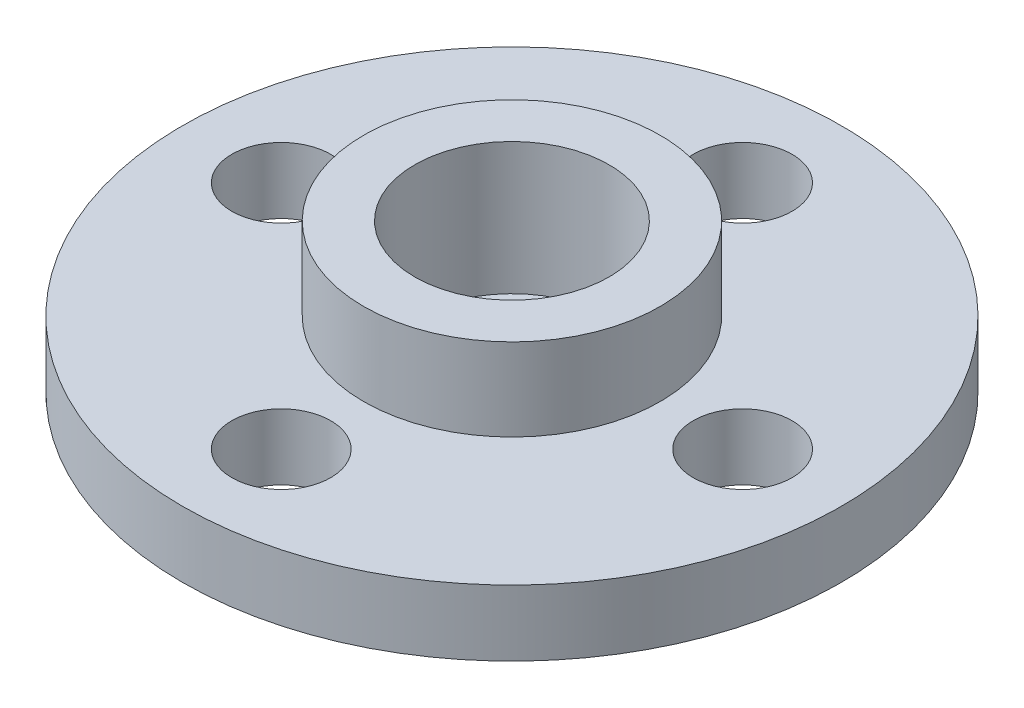
ISO-10303-21;
HEADER;
FILE_DESCRIPTION(('STEP AP214'),'2;1');
FILE_NAME('part.step','',(''),(''),'','','');
FILE_SCHEMA(('AUTOMOTIVE_DESIGN { 1 0 10303 214 1 1 1 1 }'));
ENDSEC;
DATA;
#1=APPLICATION_CONTEXT('core data for automotive mechanical design processes');
#2=APPLICATION_PROTOCOL_DEFINITION('international standard','automotive_design',2000,#1);
#3=PRODUCT_CONTEXT('',#1,'mechanical');
#4=PRODUCT('Part','Part','',(#3));
#5=PRODUCT_RELATED_PRODUCT_CATEGORY('part','',(#4));
#6=PRODUCT_DEFINITION_FORMATION('','',#4);
#7=PRODUCT_DEFINITION_CONTEXT('part definition',#1,'design');
#8=PRODUCT_DEFINITION('design','',#6,#7);
#9=PRODUCT_DEFINITION_SHAPE('','',#8);
#10=(LENGTH_UNIT() NAMED_UNIT(*) SI_UNIT(.MILLI.,.METRE.));
#11=(NAMED_UNIT(*) PLANE_ANGLE_UNIT() SI_UNIT($,.RADIAN.));
#12=(NAMED_UNIT(*) SI_UNIT($,.STERADIAN.) SOLID_ANGLE_UNIT());
#13=UNCERTAINTY_MEASURE_WITH_UNIT(LENGTH_MEASURE(1.E-05),#10,'distance_accuracy_value','');
#14=(GEOMETRIC_REPRESENTATION_CONTEXT(3) GLOBAL_UNCERTAINTY_ASSIGNED_CONTEXT((#13)) GLOBAL_UNIT_ASSIGNED_CONTEXT((#10,
#11,#12)) REPRESENTATION_CONTEXT('',''));
#15=CARTESIAN_POINT('',(0.,0.,0.));
#16=DIRECTION('',(0.,0.,1.));
#17=DIRECTION('',(1.,0.,0.));
#18=AXIS2_PLACEMENT_3D('',#15,#16,#17);
#19=CARTESIAN_POINT('',(0.,2.,0.));
#20=DIRECTION('',(0.,-1.,0.));
#21=DIRECTION('',(0.,0.,-1.));
#22=AXIS2_PLACEMENT_3D('',#19,#20,#21);
#23=CYLINDRICAL_SURFACE('',#22,10.);
#24=CARTESIAN_POINT('',(0.,2.,0.));
#25=DIRECTION('',(0.,1.,0.));
#26=DIRECTION('',(0.,0.,1.));
#27=AXIS2_PLACEMENT_3D('',#24,#25,#26);
#28=CIRCLE('',#27,10.);
#29=CARTESIAN_POINT('',(0.,2.,10.));
#30=VERTEX_POINT('',#29);
#31=EDGE_CURVE('E10',#30,#30,#28,.T.);
#32=ORIENTED_EDGE('',*,*,#31,.F.);
#33=EDGE_LOOP('',(#32));
#34=FACE_BOUND('',#33,.T.);
#35=CARTESIAN_POINT('',(0.,0.,0.));
#36=DIRECTION('',(0.,1.,0.));
#37=DIRECTION('',(0.,0.,1.));
#38=AXIS2_PLACEMENT_3D('',#35,#36,#37);
#39=CIRCLE('',#38,10.);
#40=CARTESIAN_POINT('',(0.,0.,10.));
#41=VERTEX_POINT('',#40);
#42=EDGE_CURVE('E40',#41,#41,#39,.T.);
#43=ORIENTED_EDGE('',*,*,#42,.T.);
#44=EDGE_LOOP('',(#43));
#45=FACE_BOUND('',#44,.T.);
#46=ADVANCED_FACE('F33',(#34,#45),#23,.T.);
#47=CARTESIAN_POINT('',(0.,2.,0.));
#48=DIRECTION('',(0.,1.,0.));
#49=DIRECTION('',(0.,0.,1.));
#50=AXIS2_PLACEMENT_3D('',#47,#48,#49);
#51=PLANE('',#50);
#52=CARTESIAN_POINT('',(0.,2.,-7.));
#53=DIRECTION('',(0.,1.,0.));
#54=DIRECTION('',(0.,0.,1.));
#55=AXIS2_PLACEMENT_3D('',#52,#53,#54);
#56=CIRCLE('',#55,1.5);
#57=CARTESIAN_POINT('',(0.,2.,-5.5));
#58=VERTEX_POINT('',#57);
#59=EDGE_CURVE('E82',#58,#58,#56,.T.);
#60=ORIENTED_EDGE('',*,*,#59,.F.);
#61=EDGE_LOOP('',(#60));
#62=FACE_BOUND('',#61,.T.);
#63=CARTESIAN_POINT('',(7.0000000000002,2.,-1.98094713253425E-13));
#64=DIRECTION('',(0.,1.,0.));
#65=DIRECTION('',(0.,0.,1.));
#66=AXIS2_PLACEMENT_3D('',#63,#64,#65);
#67=CIRCLE('',#66,1.5);
#68=CARTESIAN_POINT('',(7.0000000000002,2.,1.4999999999998));
#69=VERTEX_POINT('',#68);
#70=EDGE_CURVE('E76',#69,#69,#67,.T.);
#71=ORIENTED_EDGE('',*,*,#70,.F.);
#72=EDGE_LOOP('',(#71));
#73=FACE_BOUND('',#72,.T.);
#74=CARTESIAN_POINT('',(3.9618942650685E-13,2.,7.));
#75=DIRECTION('',(0.,1.,0.));
#76=DIRECTION('',(0.,0.,1.));
#77=AXIS2_PLACEMENT_3D('',#74,#75,#76);
#78=CIRCLE('',#77,1.5);
#79=CARTESIAN_POINT('',(3.9618942650685E-13,2.,8.5));
#80=VERTEX_POINT('',#79);
#81=EDGE_CURVE('E70',#80,#80,#78,.T.);
#82=ORIENTED_EDGE('',*,*,#81,.F.);
#83=EDGE_LOOP('',(#82));
#84=FACE_BOUND('',#83,.T.);
#85=CARTESIAN_POINT('',(-6.9999999999998,2.,1.97237460494022E-13));
#86=DIRECTION('',(0.,1.,0.));
#87=DIRECTION('',(0.,0.,1.));
#88=AXIS2_PLACEMENT_3D('',#85,#86,#87);
#89=CIRCLE('',#88,1.5);
#90=CARTESIAN_POINT('',(-6.9999999999998,2.,1.5000000000002));
#91=VERTEX_POINT('',#90);
#92=EDGE_CURVE('E64',#91,#91,#89,.T.);
#93=ORIENTED_EDGE('',*,*,#92,.F.);
#94=EDGE_LOOP('',(#93));
#95=FACE_BOUND('',#94,.T.);
#96=CARTESIAN_POINT('',(0.,2.,0.));
#97=DIRECTION('',(0.,1.,0.));
#98=DIRECTION('',(0.,0.,1.));
#99=AXIS2_PLACEMENT_3D('',#96,#97,#98);
#100=CIRCLE('',#99,4.5);
#101=CARTESIAN_POINT('',(0.,2.,4.5));
#102=VERTEX_POINT('',#101);
#103=EDGE_CURVE('E47',#102,#102,#100,.T.);
#104=ORIENTED_EDGE('',*,*,#103,.F.);
#105=EDGE_LOOP('',(#104));
#106=FACE_BOUND('',#105,.T.);
#107=ORIENTED_EDGE('',*,*,#31,.T.);
#108=EDGE_LOOP('',(#107));
#109=FACE_BOUND('',#108,.T.);
#110=ADVANCED_FACE('F88',(#62,#73,#84,#95,#106,#109),#51,.T.);
#111=CARTESIAN_POINT('',(0.,0.,0.));
#112=DIRECTION('',(0.,1.,0.));
#113=DIRECTION('',(0.,0.,1.));
#114=AXIS2_PLACEMENT_3D('',#111,#112,#113);
#115=PLANE('',#114);
#116=CARTESIAN_POINT('',(0.,0.,-7.));
#117=DIRECTION('',(0.,1.,0.));
#118=DIRECTION('',(0.,0.,1.));
#119=AXIS2_PLACEMENT_3D('',#116,#117,#118);
#120=CIRCLE('',#119,1.5);
#121=CARTESIAN_POINT('',(0.,0.,-5.5));
#122=VERTEX_POINT('',#121);
#123=EDGE_CURVE('E79',#122,#122,#120,.T.);
#124=ORIENTED_EDGE('',*,*,#123,.T.);
#125=EDGE_LOOP('',(#124));
#126=FACE_BOUND('',#125,.T.);
#127=CARTESIAN_POINT('',(7.0000000000002,0.,-1.98094713253425E-13));
#128=DIRECTION('',(0.,1.,0.));
#129=DIRECTION('',(0.,0.,1.));
#130=AXIS2_PLACEMENT_3D('',#127,#128,#129);
#131=CIRCLE('',#130,1.5);
#132=CARTESIAN_POINT('',(7.0000000000002,0.,1.4999999999998));
#133=VERTEX_POINT('',#132);
#134=EDGE_CURVE('E73',#133,#133,#131,.T.);
#135=ORIENTED_EDGE('',*,*,#134,.T.);
#136=EDGE_LOOP('',(#135));
#137=FACE_BOUND('',#136,.T.);
#138=CARTESIAN_POINT('',(3.9618942650685E-13,0.,7.));
#139=DIRECTION('',(0.,1.,0.));
#140=DIRECTION('',(0.,0.,1.));
#141=AXIS2_PLACEMENT_3D('',#138,#139,#140);
#142=CIRCLE('',#141,1.5);
#143=CARTESIAN_POINT('',(3.9618942650685E-13,0.,8.5));
#144=VERTEX_POINT('',#143);
#145=EDGE_CURVE('E67',#144,#144,#142,.T.);
#146=ORIENTED_EDGE('',*,*,#145,.T.);
#147=EDGE_LOOP('',(#146));
#148=FACE_BOUND('',#147,.T.);
#149=CARTESIAN_POINT('',(-6.9999999999998,0.,1.97237460494022E-13));
#150=DIRECTION('',(0.,1.,0.));
#151=DIRECTION('',(0.,0.,1.));
#152=AXIS2_PLACEMENT_3D('',#149,#150,#151);
#153=CIRCLE('',#152,1.5);
#154=CARTESIAN_POINT('',(-6.9999999999998,0.,1.5000000000002));
#155=VERTEX_POINT('',#154);
#156=EDGE_CURVE('E61',#155,#155,#153,.T.);
#157=ORIENTED_EDGE('',*,*,#156,.T.);
#158=EDGE_LOOP('',(#157));
#159=FACE_BOUND('',#158,.T.);
#160=CARTESIAN_POINT('',(1.97666086873723E-13,0.,0.));
#161=DIRECTION('',(0.,1.,0.));
#162=DIRECTION('',(0.,0.,1.));
#163=AXIS2_PLACEMENT_3D('',#160,#161,#162);
#164=CIRCLE('',#163,1.5);
#165=CARTESIAN_POINT('',(1.97666086873723E-13,0.,1.5));
#166=VERTEX_POINT('',#165);
#167=EDGE_CURVE('E58',#166,#166,#164,.T.);
#168=ORIENTED_EDGE('',*,*,#167,.T.);
#169=EDGE_LOOP('',(#168));
#170=FACE_BOUND('',#169,.T.);
#171=ORIENTED_EDGE('',*,*,#42,.F.);
#172=EDGE_LOOP('',(#171));
#173=FACE_BOUND('',#172,.T.);
#174=ADVANCED_FACE('F91',(#126,#137,#148,#159,#170,#173),#115,.F.);
#175=CARTESIAN_POINT('',(0.,4.5,0.));
#176=DIRECTION('',(0.,-1.,0.));
#177=DIRECTION('',(0.,0.,-1.));
#178=AXIS2_PLACEMENT_3D('',#175,#176,#177);
#179=CYLINDRICAL_SURFACE('',#178,4.5);
#180=CARTESIAN_POINT('',(0.,4.5,0.));
#181=DIRECTION('',(0.,1.,0.));
#182=DIRECTION('',(0.,0.,1.));
#183=AXIS2_PLACEMENT_3D('',#180,#181,#182);
#184=CIRCLE('',#183,4.5);
#185=CARTESIAN_POINT('',(0.,4.5,4.5));
#186=VERTEX_POINT('',#185);
#187=EDGE_CURVE('E45',#186,#186,#184,.T.);
#188=ORIENTED_EDGE('',*,*,#187,.F.);
#189=EDGE_LOOP('',(#188));
#190=FACE_BOUND('',#189,.T.);
#191=ORIENTED_EDGE('',*,*,#103,.T.);
#192=EDGE_LOOP('',(#191));
#193=FACE_BOUND('',#192,.T.);
#194=ADVANCED_FACE('F101',(#190,#193),#179,.T.);
#195=CARTESIAN_POINT('',(0.,4.5,0.));
#196=DIRECTION('',(0.,1.,0.));
#197=DIRECTION('',(0.,0.,1.));
#198=AXIS2_PLACEMENT_3D('',#195,#196,#197);
#199=PLANE('',#198);
#200=CARTESIAN_POINT('',(0.,4.5,0.));
#201=DIRECTION('',(0.,1.,0.));
#202=DIRECTION('',(0.,0.,1.));
#203=AXIS2_PLACEMENT_3D('',#200,#201,#202);
#204=CIRCLE('',#203,2.95);
#205=CARTESIAN_POINT('',(0.,4.5,2.95));
#206=VERTEX_POINT('',#205);
#207=EDGE_CURVE('E53',#206,#206,#204,.T.);
#208=ORIENTED_EDGE('',*,*,#207,.F.);
#209=EDGE_LOOP('',(#208));
#210=FACE_BOUND('',#209,.T.);
#211=ORIENTED_EDGE('',*,*,#187,.T.);
#212=EDGE_LOOP('',(#211));
#213=FACE_BOUND('',#212,.T.);
#214=ADVANCED_FACE('F103',(#210,#213),#199,.T.);
#215=CARTESIAN_POINT('',(0.,0.5,0.));
#216=DIRECTION('',(0.,1.,0.));
#217=DIRECTION('',(0.,0.,1.));
#218=AXIS2_PLACEMENT_3D('',#215,#216,#217);
#219=CYLINDRICAL_SURFACE('',#218,2.95);
#220=CARTESIAN_POINT('',(0.,0.5,0.));
#221=DIRECTION('',(0.,1.,0.));
#222=DIRECTION('',(0.,0.,1.));
#223=AXIS2_PLACEMENT_3D('',#220,#221,#222);
#224=CIRCLE('',#223,2.95);
#225=CARTESIAN_POINT('',(0.,0.5,2.95));
#226=VERTEX_POINT('',#225);
#227=EDGE_CURVE('E50',#226,#226,#224,.T.);
#228=ORIENTED_EDGE('',*,*,#227,.F.);
#229=EDGE_LOOP('',(#228));
#230=FACE_BOUND('',#229,.T.);
#231=ORIENTED_EDGE('',*,*,#207,.T.);
#232=EDGE_LOOP('',(#231));
#233=FACE_BOUND('',#232,.T.);
#234=ADVANCED_FACE('F110',(#230,#233),#219,.F.);
#235=CARTESIAN_POINT('',(0.,0.5,0.));
#236=DIRECTION('',(0.,1.,0.));
#237=DIRECTION('',(0.,0.,1.));
#238=AXIS2_PLACEMENT_3D('',#235,#236,#237);
#239=PLANE('',#238);
#240=CARTESIAN_POINT('',(1.97666086873723E-13,0.5,0.));
#241=DIRECTION('',(0.,1.,0.));
#242=DIRECTION('',(0.,0.,1.));
#243=AXIS2_PLACEMENT_3D('',#240,#241,#242);
#244=CIRCLE('',#243,1.5);
#245=CARTESIAN_POINT('',(1.97666086873723E-13,0.5,1.5));
#246=VERTEX_POINT('',#245);
#247=EDGE_CURVE('E36',#246,#246,#244,.T.);
#248=ORIENTED_EDGE('',*,*,#247,.F.);
#249=EDGE_LOOP('',(#248));
#250=FACE_BOUND('',#249,.T.);
#251=ORIENTED_EDGE('',*,*,#227,.T.);
#252=EDGE_LOOP('',(#251));
#253=FACE_BOUND('',#252,.T.);
#254=ADVANCED_FACE('F137',(#250,#253),#239,.T.);
#255=CARTESIAN_POINT('',(1.97666086873723E-13,2.,0.));
#256=DIRECTION('',(0.,1.,0.));
#257=DIRECTION('',(0.,0.,1.));
#258=AXIS2_PLACEMENT_3D('',#255,#256,#257);
#259=CYLINDRICAL_SURFACE('',#258,1.5);
#260=ORIENTED_EDGE('',*,*,#247,.T.);
#261=EDGE_LOOP('',(#260));
#262=FACE_BOUND('',#261,.T.);
#263=ORIENTED_EDGE('',*,*,#167,.F.);
#264=EDGE_LOOP('',(#263));
#265=FACE_BOUND('',#264,.T.);
#266=ADVANCED_FACE('F142',(#262,#265),#259,.F.);
#267=CARTESIAN_POINT('',(-6.9999999999998,2.,1.97237460494022E-13));
#268=DIRECTION('',(0.,1.,0.));
#269=DIRECTION('',(0.,0.,1.));
#270=AXIS2_PLACEMENT_3D('',#267,#268,#269);
#271=CYLINDRICAL_SURFACE('',#270,1.5);
#272=ORIENTED_EDGE('',*,*,#156,.F.);
#273=EDGE_LOOP('',(#272));
#274=FACE_BOUND('',#273,.T.);
#275=ORIENTED_EDGE('',*,*,#92,.T.);
#276=EDGE_LOOP('',(#275));
#277=FACE_BOUND('',#276,.T.);
#278=ADVANCED_FACE('F154',(#274,#277),#271,.F.);
#279=CARTESIAN_POINT('',(3.9618942650685E-13,2.,7.));
#280=DIRECTION('',(0.,1.,0.));
#281=DIRECTION('',(0.,0.,1.));
#282=AXIS2_PLACEMENT_3D('',#279,#280,#281);
#283=CYLINDRICAL_SURFACE('',#282,1.5);
#284=ORIENTED_EDGE('',*,*,#145,.F.);
#285=EDGE_LOOP('',(#284));
#286=FACE_BOUND('',#285,.T.);
#287=ORIENTED_EDGE('',*,*,#81,.T.);
#288=EDGE_LOOP('',(#287));
#289=FACE_BOUND('',#288,.T.);
#290=ADVANCED_FACE('F164',(#286,#289),#283,.F.);
#291=CARTESIAN_POINT('',(7.0000000000002,2.,-1.98094713253425E-13));
#292=DIRECTION('',(0.,1.,0.));
#293=DIRECTION('',(0.,0.,1.));
#294=AXIS2_PLACEMENT_3D('',#291,#292,#293);
#295=CYLINDRICAL_SURFACE('',#294,1.5);
#296=ORIENTED_EDGE('',*,*,#134,.F.);
#297=EDGE_LOOP('',(#296));
#298=FACE_BOUND('',#297,.T.);
#299=ORIENTED_EDGE('',*,*,#70,.T.);
#300=EDGE_LOOP('',(#299));
#301=FACE_BOUND('',#300,.T.);
#302=ADVANCED_FACE('F174',(#298,#301),#295,.F.);
#303=CARTESIAN_POINT('',(0.,2.,-7.));
#304=DIRECTION('',(0.,1.,0.));
#305=DIRECTION('',(0.,0.,1.));
#306=AXIS2_PLACEMENT_3D('',#303,#304,#305);
#307=CYLINDRICAL_SURFACE('',#306,1.5);
#308=ORIENTED_EDGE('',*,*,#123,.F.);
#309=EDGE_LOOP('',(#308));
#310=FACE_BOUND('',#309,.T.);
#311=ORIENTED_EDGE('',*,*,#59,.T.);
#312=EDGE_LOOP('',(#311));
#313=FACE_BOUND('',#312,.T.);
#314=ADVANCED_FACE('F86',(#310,#313),#307,.F.);
#315=CLOSED_SHELL('',(#46,#110,#174,#194,#214,#234,#254,#266,#278,#290,#302,#314));
#316=MANIFOLD_SOLID_BREP('B2',#315);
#317=ADVANCED_BREP_SHAPE_REPRESENTATION('',(#18,#316),#14);
#318=SHAPE_DEFINITION_REPRESENTATION(#9,#317);
ENDSEC;
END-ISO-10303-21;
